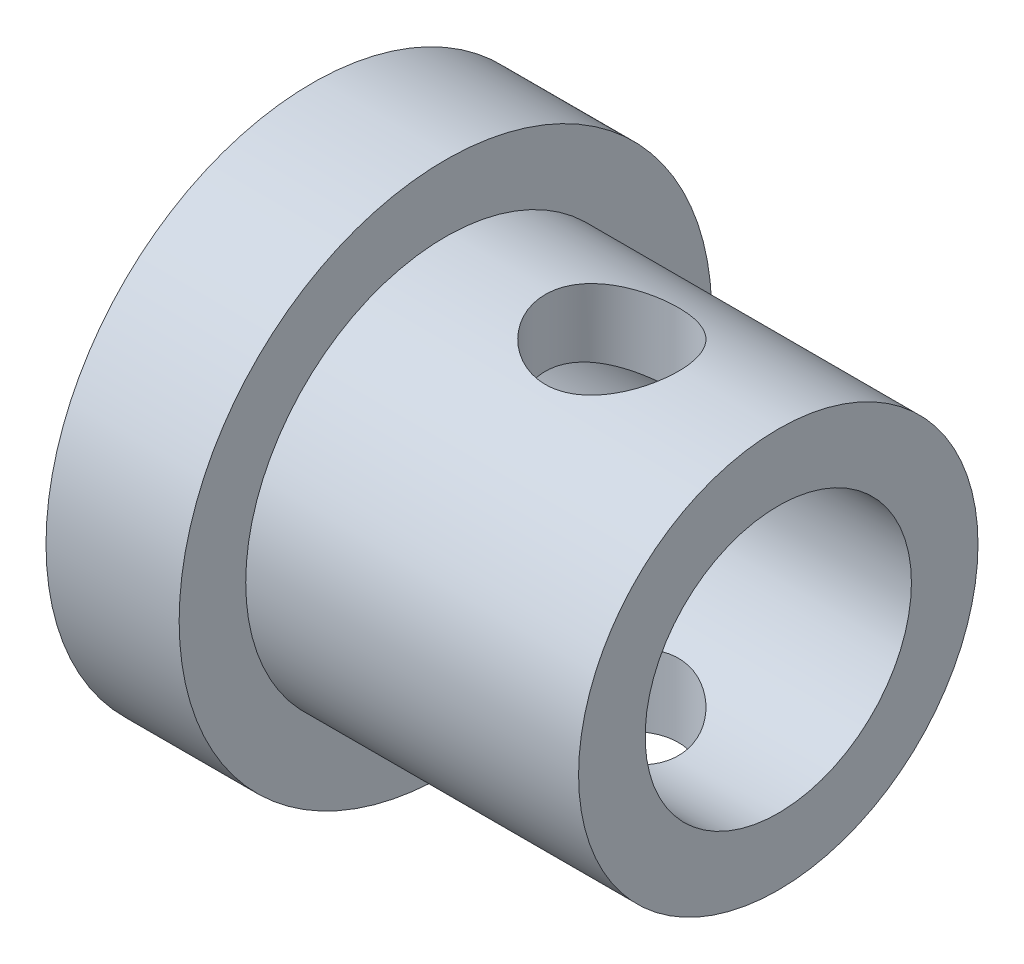
ISO-10303-21;
HEADER;
FILE_DESCRIPTION(('STEP AP214'),'2;1');
FILE_NAME('part.step','',(''),(''),'','','');
FILE_SCHEMA(('AUTOMOTIVE_DESIGN { 1 0 10303 214 1 1 1 1 }'));
ENDSEC;
DATA;
#1=APPLICATION_CONTEXT('core data for automotive mechanical design processes');
#2=APPLICATION_PROTOCOL_DEFINITION('international standard','automotive_design',2000,#1);
#3=PRODUCT_CONTEXT('',#1,'mechanical');
#4=PRODUCT('Part','Part','',(#3));
#5=PRODUCT_RELATED_PRODUCT_CATEGORY('part','',(#4));
#6=PRODUCT_DEFINITION_FORMATION('','',#4);
#7=PRODUCT_DEFINITION_CONTEXT('part definition',#1,'design');
#8=PRODUCT_DEFINITION('design','',#6,#7);
#9=PRODUCT_DEFINITION_SHAPE('','',#8);
#10=(LENGTH_UNIT() NAMED_UNIT(*) SI_UNIT(.MILLI.,.METRE.));
#11=(NAMED_UNIT(*) PLANE_ANGLE_UNIT() SI_UNIT($,.RADIAN.));
#12=(NAMED_UNIT(*) SI_UNIT($,.STERADIAN.) SOLID_ANGLE_UNIT());
#13=UNCERTAINTY_MEASURE_WITH_UNIT(LENGTH_MEASURE(1.E-05),#10,'distance_accuracy_value','');
#14=(GEOMETRIC_REPRESENTATION_CONTEXT(3) GLOBAL_UNCERTAINTY_ASSIGNED_CONTEXT((#13)) GLOBAL_UNIT_ASSIGNED_CONTEXT((#10,
#11,#12)) REPRESENTATION_CONTEXT('',''));
#15=CARTESIAN_POINT('',(0.,0.,0.));
#16=DIRECTION('',(0.,0.,1.));
#17=DIRECTION('',(1.,0.,0.));
#18=AXIS2_PLACEMENT_3D('',#15,#16,#17);
#19=CARTESIAN_POINT('',(3.5,0.,0.));
#20=DIRECTION('',(-1.,0.,0.));
#21=DIRECTION('',(0.,0.,1.));
#22=AXIS2_PLACEMENT_3D('',#19,#20,#21);
#23=CYLINDRICAL_SURFACE('',#22,3.);
#24=CARTESIAN_POINT('',(1.,-2.82842712474619,1.));
#25=CARTESIAN_POINT('',(1.05446817481068,-2.82842694532735,1.0000002579478));
#26=CARTESIAN_POINT('',(1.10893479977153,-2.83001769372806,0.99553478369814));
#27=CARTESIAN_POINT('',(1.21625442095062,-2.8361757417458,0.977851131702564));
#28=CARTESIAN_POINT('',(1.26910714986394,-2.8407435316722,0.964631512170673));
#29=CARTESIAN_POINT('',(1.37162689301281,-2.85228203663888,0.929955485680262));
#30=CARTESIAN_POINT('',(1.42129992944688,-2.8592480396464,0.908515221402));
#31=CARTESIAN_POINT('',(1.5163600485438,-2.87479122017008,0.858061628442627));
#32=CARTESIAN_POINT('',(1.5617461825525,-2.88336875305432,0.829046628860522));
#33=CARTESIAN_POINT('',(1.64871996233949,-2.90154489405589,0.763051146442527));
#34=CARTESIAN_POINT('',(1.69011542867204,-2.91116894844139,0.725824341377825));
#35=CARTESIAN_POINT('',(1.76620680122432,-2.93013864801508,0.644987667214489));
#36=CARTESIAN_POINT('',(1.80090163158228,-2.93948424829099,0.601376775052401));
#37=CARTESIAN_POINT('',(1.86347889732968,-2.95713866921658,0.507604507964983));
#38=CARTESIAN_POINT('',(1.89115997061798,-2.96541407701568,0.457301911224518));
#39=CARTESIAN_POINT('',(1.93759158512749,-2.97969586771021,0.352431222987481));
#40=CARTESIAN_POINT('',(1.9563445331769,-2.98570286203012,0.297864285687214));
#41=CARTESIAN_POINT('',(1.9837358546324,-2.99459075431897,0.188028817433492));
#42=CARTESIAN_POINT('',(1.99270344625701,-2.99757314777558,0.132850754852967));
#43=CARTESIAN_POINT('',(2.00131629336066,-3.00043608218249,0.0216978748240906));
#44=CARTESIAN_POINT('',(2.00096395165242,-3.00031742262891,-0.0342767335438934));
#45=CARTESIAN_POINT('',(1.99115574543397,-2.99706039618736,-0.143103515193818));
#46=CARTESIAN_POINT('',(1.98205747152549,-2.99404064755135,-0.195992048591668));
#47=CARTESIAN_POINT('',(1.95560701901955,-2.98546967339714,-0.299443438822161));
#48=CARTESIAN_POINT('',(1.93825428102024,-2.97991827631115,-0.350006137779176));
#49=CARTESIAN_POINT('',(1.89557868269387,-2.96675670293292,-0.448152474842014));
#50=CARTESIAN_POINT('',(1.87015406145322,-2.9591204252427,-0.495688220968999));
#51=CARTESIAN_POINT('',(1.81214029455161,-2.94258393038665,-0.58592432552717));
#52=CARTESIAN_POINT('',(1.77954915667336,-2.93368336200518,-0.62862333438477));
#53=CARTESIAN_POINT('',(1.70632560653926,-2.9150619185089,-0.710100866551907));
#54=CARTESIAN_POINT('',(1.66538684215456,-2.90532215172667,-0.748600157067556));
#55=CARTESIAN_POINT('',(1.57755127427734,-2.88647335245111,-0.81827725959589));
#56=CARTESIAN_POINT('',(1.53065355428676,-2.8773644173145,-0.849453943273005));
#57=CARTESIAN_POINT('',(1.43134637438458,-2.86070525135531,-0.903987455042732));
#58=CARTESIAN_POINT('',(1.37886786863219,-2.85317909338821,-0.927226463651049));
#59=CARTESIAN_POINT('',(1.27042860573374,-2.84081650878299,-0.964443193299507));
#60=CARTESIAN_POINT('',(1.21446931877818,-2.83597895501223,-0.978424795755529));
#61=CARTESIAN_POINT('',(1.10336164459938,-2.8297963630207,-0.996161282090474));
#62=CARTESIAN_POINT('',(1.04829057525428,-2.82830360315139,-1.00034909550575));
#63=CARTESIAN_POINT('',(0.938223850882962,-2.828566720628,-0.999605438911605));
#64=CARTESIAN_POINT('',(0.883228183975239,-2.83032200792768,-0.99467562522726));
#65=CARTESIAN_POINT('',(0.776843034288837,-2.83673618089379,-0.97622565155183));
#66=CARTESIAN_POINT('',(0.725394569849359,-2.84129325440593,-0.963006393980555));
#67=CARTESIAN_POINT('',(0.625456393760615,-2.8526855367127,-0.928713862560596));
#68=CARTESIAN_POINT('',(0.576967208409165,-2.85952114934907,-0.907639196363457));
#69=CARTESIAN_POINT('',(0.482619579153058,-2.87496877595718,-0.8574743407389));
#70=CARTESIAN_POINT('',(0.436893357358213,-2.8836302566561,-0.828151118358487));
#71=CARTESIAN_POINT('',(0.350853947616265,-2.90165768730984,-0.762585630557568));
#72=CARTESIAN_POINT('',(0.310542361338776,-2.911023844438,-0.726341325498784));
#73=CARTESIAN_POINT('',(0.234472015909365,-2.92995038637844,-0.645891705900322));
#74=CARTESIAN_POINT('',(0.199025609981151,-2.93949843577895,-0.601387270546651));
#75=CARTESIAN_POINT('',(0.136083857651955,-2.9572685161311,-0.506827291400257));
#76=CARTESIAN_POINT('',(0.108588228837575,-2.96549059417695,-0.456771944864552));
#77=CARTESIAN_POINT('',(0.062579895138285,-2.97964405810603,-0.352779862432295));
#78=CARTESIAN_POINT('',(0.0440087228519343,-2.98559030004531,-0.298871123321196));
#79=CARTESIAN_POINT('',(0.0162722579398949,-2.99458610837774,-0.188458465846016));
#80=CARTESIAN_POINT('',(0.00710357011949681,-2.99763672034018,-0.131955491953889));
#81=CARTESIAN_POINT('',(-0.00126207760564187,-3.00041863236257,-0.0208153358600406));
#82=CARTESIAN_POINT('',(-0.000907453932375802,-3.00029920089441,0.0337847239200191));
#83=CARTESIAN_POINT('',(0.00865730814640729,-2.99712196519396,0.142111145000174));
#84=CARTESIAN_POINT('',(0.0178667281527638,-2.99406439933567,0.195837576819055));
#85=CARTESIAN_POINT('',(0.0445822345759675,-2.98540914954421,0.300042119432061));
#86=CARTESIAN_POINT('',(0.0619542153529519,-2.9798525836118,0.350558270912795));
#87=CARTESIAN_POINT('',(0.104377531097136,-2.96677160704464,0.44797835093979));
#88=CARTESIAN_POINT('',(0.129430255196942,-2.95924684047901,0.49488162414241));
#89=CARTESIAN_POINT('',(0.187569512102081,-2.94265868828001,0.585634016308809));
#90=CARTESIAN_POINT('',(0.22091868538192,-2.93354872492381,0.629306251557697));
#91=CARTESIAN_POINT('',(0.294257391155915,-2.91492988791425,0.710581026272338));
#92=CARTESIAN_POINT('',(0.334249042261682,-2.90542088771397,0.748181621624259));
#93=CARTESIAN_POINT('',(0.421609355588035,-2.88663279827365,0.817741808833464));
#94=CARTESIAN_POINT('',(0.469205510980768,-2.87737727995345,0.849422965999216));
#95=CARTESIAN_POINT('',(0.569334426898652,-2.86060193316303,0.904314343299799));
#96=CARTESIAN_POINT('',(0.621865893014244,-2.8530816513617,0.927526776814559));
#97=CARTESIAN_POINT('',(0.727961824023833,-2.84101334230535,0.963843828206626));
#98=CARTESIAN_POINT('',(0.781372263565722,-2.83634632944799,0.977357909163268));
#99=CARTESIAN_POINT('',(0.889856050515475,-2.83005383613939,0.995434320161694));
#100=CARTESIAN_POINT('',(0.944928817435749,-2.82842730615135,0.999999739196502));
#101=CARTESIAN_POINT('',(1.,-2.82842712474619,1.));
#102=B_SPLINE_CURVE_WITH_KNOTS('',3,(#24,#25,#26,#27,#28,#29,#30,#31,#32,#33,#34,#35,#36,#37,
#38,#39,#40,#41,#42,#43,#44,#45,#46,#47,#48,#49,#50,#51,#52,#53,#54,#55,#56,#57,#58,#59,#60,#61,
#62,#63,#64,#65,#66,#67,#68,#69,#70,#71,#72,#73,#74,#75,#76,#77,#78,#79,#80,#81,#82,#83,#84,#85,
#86,#87,#88,#89,#90,#91,#92,#93,#94,#95,#96,#97,#98,#99,#100,#101),.UNSPECIFIED.,.T.,.F.,(4,2,2,
2,2,2,2,2,2,2,2,2,2,2,2,2,2,2,2,2,2,2,2,2,2,2,2,2,2,2,2,2,2,2,2,2,2,2,4),(0.,0.163200584775417,
0.32642805496888,0.489336627454544,0.652281166139159,0.821013374229398,0.989772651673597,
1.16293506139029,1.33605076382161,1.50314318760306,1.67019253297699,1.83069004820941,
1.99119844184608,2.15381654855707,2.31647991869394,2.48680174359289,2.65714979607478,
2.82992639837376,3.00263051349689,3.16754291357512,3.33242535830307,3.49164395761849,
3.65089079140019,3.81518857728788,3.979534856552,4.15178808164166,4.32403518750605,
4.49513791183924,4.66617882997229,4.82918084670708,4.99216964002854,5.15256956033503,
5.31299850756315,5.47935519513706,5.64576504425704,5.81868902729217,5.99156778259939,
6.15663212153686,6.32163947179229),.UNSPECIFIED.);
#103=CARTESIAN_POINT('',(1.,-2.82842712474619,1.));
#104=VERTEX_POINT('',#103);
#105=EDGE_CURVE('E72',#104,#104,#102,.T.);
#106=ORIENTED_EDGE('',*,*,#105,.T.);
#107=EDGE_LOOP('',(#106));
#108=FACE_BOUND('',#107,.T.);
#109=CARTESIAN_POINT('',(1.,2.82842712474619,1.));
#110=CARTESIAN_POINT('',(0.945531825189323,2.82842694532735,1.0000002579478));
#111=CARTESIAN_POINT('',(0.891065200228475,2.83001769372806,0.99553478369814));
#112=CARTESIAN_POINT('',(0.783745579049384,2.8361757417458,0.977851131702564));
#113=CARTESIAN_POINT('',(0.730892850136063,2.8407435316722,0.964631512170674));
#114=CARTESIAN_POINT('',(0.628373106987187,2.85228203663888,0.929955485680263));
#115=CARTESIAN_POINT('',(0.578700070553118,2.8592480396464,0.908515221402));
#116=CARTESIAN_POINT('',(0.483639951456205,2.87479122017008,0.858061628442627));
#117=CARTESIAN_POINT('',(0.438253817447503,2.88336875305432,0.829046628860523));
#118=CARTESIAN_POINT('',(0.351280037660512,2.90154489405589,0.763051146442527));
#119=CARTESIAN_POINT('',(0.309884571327957,2.91116894844139,0.725824341377825));
#120=CARTESIAN_POINT('',(0.233793198775676,2.93013864801508,0.644987667214489));
#121=CARTESIAN_POINT('',(0.199098368417716,2.93948424829099,0.601376775052402));
#122=CARTESIAN_POINT('',(0.136521102670319,2.95713866921658,0.507604507964984));
#123=CARTESIAN_POINT('',(0.108840029382019,2.96541407701568,0.457301911224518));
#124=CARTESIAN_POINT('',(0.0624084148725132,2.9796958677102,0.352431222987481));
#125=CARTESIAN_POINT('',(0.0436554668231001,2.98570286203012,0.297864285687214));
#126=CARTESIAN_POINT('',(0.0162641453676014,2.99459075431897,0.188028817433493));
#127=CARTESIAN_POINT('',(0.00729655374299271,2.99757314777558,0.132850754852967));
#128=CARTESIAN_POINT('',(-0.0013162933606595,3.00043608218249,0.0216978748240912));
#129=CARTESIAN_POINT('',(-0.000963951652417497,3.00031742262891,-0.0342767335438928));
#130=CARTESIAN_POINT('',(0.00884425456603261,2.99706039618736,-0.143103515193817));
#131=CARTESIAN_POINT('',(0.0179425284745069,2.99404064755135,-0.195992048591667));
#132=CARTESIAN_POINT('',(0.0443929809804537,2.98546967339714,-0.299443438822161));
#133=CARTESIAN_POINT('',(0.0617457189797547,2.97991827631115,-0.350006137779175));
#134=CARTESIAN_POINT('',(0.104421317306129,2.96675670293292,-0.448152474842013));
#135=CARTESIAN_POINT('',(0.129845938546777,2.9591204252427,-0.495688220968998));
#136=CARTESIAN_POINT('',(0.18785970544839,2.94258393038665,-0.585924325527169));
#137=CARTESIAN_POINT('',(0.220450843326638,2.93368336200518,-0.628623334384769));
#138=CARTESIAN_POINT('',(0.293674393460737,2.9150619185089,-0.710100866551907));
#139=CARTESIAN_POINT('',(0.334613157845441,2.90532215172667,-0.748600157067556));
#140=CARTESIAN_POINT('',(0.422448725722657,2.88647335245111,-0.81827725959589));
#141=CARTESIAN_POINT('',(0.469346445713238,2.8773644173145,-0.849453943273005));
#142=CARTESIAN_POINT('',(0.568653625615415,2.86070525135531,-0.903987455042732));
#143=CARTESIAN_POINT('',(0.621132131367812,2.85317909338821,-0.927226463651049));
#144=CARTESIAN_POINT('',(0.729571394266262,2.84081650878299,-0.964443193299507));
#145=CARTESIAN_POINT('',(0.785530681221824,2.83597895501223,-0.978424795755529));
#146=CARTESIAN_POINT('',(0.896638355400619,2.8297963630207,-0.996161282090474));
#147=CARTESIAN_POINT('',(0.951709424745724,2.82830360315139,-1.00034909550575));
#148=CARTESIAN_POINT('',(1.06177614911704,2.828566720628,-0.999605438911605));
#149=CARTESIAN_POINT('',(1.11677181602476,2.83032200792768,-0.99467562522726));
#150=CARTESIAN_POINT('',(1.22315696571116,2.83673618089379,-0.97622565155183));
#151=CARTESIAN_POINT('',(1.27460543015064,2.84129325440593,-0.963006393980555));
#152=CARTESIAN_POINT('',(1.37454360623938,2.8526855367127,-0.928713862560596));
#153=CARTESIAN_POINT('',(1.42303279159083,2.85952114934907,-0.907639196363457));
#154=CARTESIAN_POINT('',(1.51738042084694,2.87496877595718,-0.857474340738901));
#155=CARTESIAN_POINT('',(1.56310664264179,2.8836302566561,-0.828151118358487));
#156=CARTESIAN_POINT('',(1.64914605238373,2.90165768730984,-0.762585630557568));
#157=CARTESIAN_POINT('',(1.68945763866122,2.91102384443799,-0.726341325498785));
#158=CARTESIAN_POINT('',(1.76552798409063,2.92995038637844,-0.645891705900323));
#159=CARTESIAN_POINT('',(1.80097439001885,2.93949843577895,-0.601387270546652));
#160=CARTESIAN_POINT('',(1.86391614234804,2.9572685161311,-0.506827291400258));
#161=CARTESIAN_POINT('',(1.89141177116242,2.96549059417695,-0.456771944864553));
#162=CARTESIAN_POINT('',(1.93742010486171,2.97964405810603,-0.352779862432296));
#163=CARTESIAN_POINT('',(1.95599127714807,2.98559030004531,-0.298871123321197));
#164=CARTESIAN_POINT('',(1.9837277420601,2.99458610837774,-0.188458465846017));
#165=CARTESIAN_POINT('',(1.9928964298805,2.99763672034018,-0.13195549195389));
#166=CARTESIAN_POINT('',(2.00126207760564,3.00041863236257,-0.0208153358600409));
#167=CARTESIAN_POINT('',(2.00090745393238,3.00029920089441,0.0337847239200188));
#168=CARTESIAN_POINT('',(1.99134269185359,2.99712196519396,0.142111145000173));
#169=CARTESIAN_POINT('',(1.98213327184724,2.99406439933567,0.195837576819055));
#170=CARTESIAN_POINT('',(1.95541776542403,2.98540914954421,0.30004211943206));
#171=CARTESIAN_POINT('',(1.93804578464705,2.9798525836118,0.350558270912795));
#172=CARTESIAN_POINT('',(1.89562246890286,2.96677160704464,0.447978350939789));
#173=CARTESIAN_POINT('',(1.87056974480306,2.95924684047901,0.494881624142409));
#174=CARTESIAN_POINT('',(1.81243048789792,2.94265868828001,0.585634016308809));
#175=CARTESIAN_POINT('',(1.77908131461808,2.93354872492381,0.629306251557696));
#176=CARTESIAN_POINT('',(1.70574260884409,2.91492988791425,0.710581026272338));
#177=CARTESIAN_POINT('',(1.66575095773832,2.90542088771397,0.748181621624259));
#178=CARTESIAN_POINT('',(1.57839064441197,2.88663279827365,0.817741808833464));
#179=CARTESIAN_POINT('',(1.53079448901923,2.87737727995345,0.849422965999216));
#180=CARTESIAN_POINT('',(1.43066557310135,2.86060193316303,0.904314343299799));
#181=CARTESIAN_POINT('',(1.37813410698576,2.8530816513617,0.927526776814559));
#182=CARTESIAN_POINT('',(1.27203817597617,2.84101334230535,0.963843828206626));
#183=CARTESIAN_POINT('',(1.21862773643428,2.83634632944799,0.977357909163268));
#184=CARTESIAN_POINT('',(1.11014394948452,2.83005383613939,0.995434320161694));
#185=CARTESIAN_POINT('',(1.05507118256425,2.82842730615135,0.999999739196502));
#186=CARTESIAN_POINT('',(1.,2.82842712474619,1.));
#187=B_SPLINE_CURVE_WITH_KNOTS('',3,(#109,#110,#111,#112,#113,#114,#115,#116,#117,#118,#119,
#120,#121,#122,#123,#124,#125,#126,#127,#128,#129,#130,#131,#132,#133,#134,#135,#136,#137,#138,
#139,#140,#141,#142,#143,#144,#145,#146,#147,#148,#149,#150,#151,#152,#153,#154,#155,#156,#157,
#158,#159,#160,#161,#162,#163,#164,#165,#166,#167,#168,#169,#170,#171,#172,#173,#174,#175,#176,
#177,#178,#179,#180,#181,#182,#183,#184,#185,#186),.UNSPECIFIED.,.T.,.F.,(4,2,2,2,2,2,2,2,2,2,2,
2,2,2,2,2,2,2,2,2,2,2,2,2,2,2,2,2,2,2,2,2,2,2,2,2,2,2,4),(0.,0.163200584775417,0.32642805496888,
0.489336627454544,0.652281166139158,0.821013374229398,0.989772651673596,1.16293506139029,
1.33605076382161,1.50314318760306,1.67019253297699,1.83069004820941,1.99119844184608,
2.15381654855707,2.31647991869394,2.48680174359289,2.65714979607478,2.82992639837376,
3.00263051349688,3.16754291357512,3.33242535830307,3.49164395761849,3.65089079140019,
3.81518857728788,3.979534856552,4.15178808164165,4.32403518750605,4.49513791183924,
4.66617882997229,4.82918084670708,4.99216964002854,5.15256956033503,5.31299850756315,
5.47935519513707,5.64576504425704,5.81868902729217,5.9915677825994,6.15663212153686,
6.32163947179229),.UNSPECIFIED.);
#188=CARTESIAN_POINT('',(1.,2.82842712474619,1.));
#189=VERTEX_POINT('',#188);
#190=EDGE_CURVE('E68',#189,#189,#187,.T.);
#191=ORIENTED_EDGE('',*,*,#190,.T.);
#192=EDGE_LOOP('',(#191));
#193=FACE_BOUND('',#192,.T.);
#194=CARTESIAN_POINT('',(3.5,0.,0.));
#195=DIRECTION('',(1.,0.,0.));
#196=DIRECTION('',(0.,0.,-1.));
#197=AXIS2_PLACEMENT_3D('',#194,#195,#196);
#198=CIRCLE('',#197,3.);
#199=CARTESIAN_POINT('',(3.5,0.,-3.));
#200=VERTEX_POINT('',#199);
#201=EDGE_CURVE('E43',#200,#200,#198,.T.);
#202=ORIENTED_EDGE('',*,*,#201,.F.);
#203=EDGE_LOOP('',(#202));
#204=FACE_BOUND('',#203,.T.);
#205=CARTESIAN_POINT('',(-1.5,0.,0.));
#206=DIRECTION('',(-1.,0.,0.));
#207=DIRECTION('',(0.,0.,1.));
#208=AXIS2_PLACEMENT_3D('',#205,#206,#207);
#209=CIRCLE('',#208,3.);
#210=CARTESIAN_POINT('',(-1.5,0.,3.));
#211=VERTEX_POINT('',#210);
#212=EDGE_CURVE('E10',#211,#211,#209,.T.);
#213=ORIENTED_EDGE('',*,*,#212,.F.);
#214=EDGE_LOOP('',(#213));
#215=FACE_BOUND('',#214,.T.);
#216=ADVANCED_FACE('F31',(#108,#193,#204,#215),#23,.T.);
#217=CARTESIAN_POINT('',(3.5,0.,0.));
#218=DIRECTION('',(1.,0.,0.));
#219=DIRECTION('',(0.,0.,-1.));
#220=AXIS2_PLACEMENT_3D('',#217,#218,#219);
#221=PLANE('',#220);
#222=CARTESIAN_POINT('',(3.5,0.,0.));
#223=DIRECTION('',(1.,0.,0.));
#224=DIRECTION('',(0.,0.,-1.));
#225=AXIS2_PLACEMENT_3D('',#222,#223,#224);
#226=CIRCLE('',#225,2.);
#227=CARTESIAN_POINT('',(3.5,0.,-2.));
#228=VERTEX_POINT('',#227);
#229=EDGE_CURVE('E77',#228,#228,#226,.T.);
#230=ORIENTED_EDGE('',*,*,#229,.F.);
#231=EDGE_LOOP('',(#230));
#232=FACE_BOUND('',#231,.T.);
#233=ORIENTED_EDGE('',*,*,#201,.T.);
#234=EDGE_LOOP('',(#233));
#235=FACE_BOUND('',#234,.T.);
#236=ADVANCED_FACE('F93',(#232,#235),#221,.T.);
#237=CARTESIAN_POINT('',(-1.5,0.,0.));
#238=DIRECTION('',(-1.,0.,0.));
#239=DIRECTION('',(0.,0.,1.));
#240=AXIS2_PLACEMENT_3D('',#237,#238,#239);
#241=CYLINDRICAL_SURFACE('',#240,4.);
#242=CARTESIAN_POINT('',(-1.5,0.,0.));
#243=DIRECTION('',(-1.,0.,0.));
#244=DIRECTION('',(0.,0.,1.));
#245=AXIS2_PLACEMENT_3D('',#242,#243,#244);
#246=CIRCLE('',#245,4.);
#247=CARTESIAN_POINT('',(-1.5,0.,4.));
#248=VERTEX_POINT('',#247);
#249=EDGE_CURVE('E48',#248,#248,#246,.T.);
#250=ORIENTED_EDGE('',*,*,#249,.T.);
#251=EDGE_LOOP('',(#250));
#252=FACE_BOUND('',#251,.T.);
#253=CARTESIAN_POINT('',(-3.5,0.,0.));
#254=DIRECTION('',(-1.,0.,0.));
#255=DIRECTION('',(0.,0.,1.));
#256=AXIS2_PLACEMENT_3D('',#253,#254,#255);
#257=CIRCLE('',#256,4.);
#258=CARTESIAN_POINT('',(-3.5,0.,4.));
#259=VERTEX_POINT('',#258);
#260=EDGE_CURVE('E81',#259,#259,#257,.T.);
#261=ORIENTED_EDGE('',*,*,#260,.F.);
#262=EDGE_LOOP('',(#261));
#263=FACE_BOUND('',#262,.T.);
#264=ADVANCED_FACE('F90',(#252,#263),#241,.T.);
#265=CARTESIAN_POINT('',(-1.5,0.,0.));
#266=DIRECTION('',(-1.,0.,0.));
#267=DIRECTION('',(0.,0.,1.));
#268=AXIS2_PLACEMENT_3D('',#265,#266,#267);
#269=PLANE('',#268);
#270=ORIENTED_EDGE('',*,*,#212,.T.);
#271=EDGE_LOOP('',(#270));
#272=FACE_BOUND('',#271,.T.);
#273=ORIENTED_EDGE('',*,*,#249,.F.);
#274=EDGE_LOOP('',(#273));
#275=FACE_BOUND('',#274,.T.);
#276=ADVANCED_FACE('F92',(#272,#275),#269,.F.);
#277=CARTESIAN_POINT('',(-3.5,0.,0.));
#278=DIRECTION('',(1.,0.,0.));
#279=DIRECTION('',(0.,0.,-1.));
#280=AXIS2_PLACEMENT_3D('',#277,#278,#279);
#281=PLANE('',#280);
#282=CARTESIAN_POINT('',(-3.5,0.,0.));
#283=DIRECTION('',(1.,0.,0.));
#284=DIRECTION('',(0.,0.,-1.));
#285=AXIS2_PLACEMENT_3D('',#282,#283,#284);
#286=CIRCLE('',#285,2.);
#287=CARTESIAN_POINT('',(-3.5,0.,-2.));
#288=VERTEX_POINT('',#287);
#289=EDGE_CURVE('E78',#288,#288,#286,.T.);
#290=ORIENTED_EDGE('',*,*,#289,.T.);
#291=EDGE_LOOP('',(#290));
#292=FACE_BOUND('',#291,.T.);
#293=ORIENTED_EDGE('',*,*,#260,.T.);
#294=EDGE_LOOP('',(#293));
#295=FACE_BOUND('',#294,.T.);
#296=ADVANCED_FACE('F88',(#292,#295),#281,.F.);
#297=CARTESIAN_POINT('',(-3.5,0.,0.));
#298=DIRECTION('',(1.,0.,0.));
#299=DIRECTION('',(0.,0.,-1.));
#300=AXIS2_PLACEMENT_3D('',#297,#298,#299);
#301=CYLINDRICAL_SURFACE('',#300,2.);
#302=CARTESIAN_POINT('',(1.,-1.73205080756888,1.));
#303=CARTESIAN_POINT('',(0.94789219180475,-1.73205534728459,0.999996363074532));
#304=CARTESIAN_POINT('',(0.895718588474954,-1.73443801187756,0.995899970733217));
#305=CARTESIAN_POINT('',(0.792972735322847,-1.74362366452052,0.979723209898053));
#306=CARTESIAN_POINT('',(0.742404084956592,-1.75043594055559,0.967626064554179));
#307=CARTESIAN_POINT('',(0.644548335656059,-1.76749346605398,0.936099948699812));
#308=CARTESIAN_POINT('',(0.597245347526413,-1.77772043473252,0.916709952493731));
#309=CARTESIAN_POINT('',(0.50657579800328,-1.80042664816858,0.871267525376372));
#310=CARTESIAN_POINT('',(0.463209449737542,-1.81290601476065,0.845214734035773));
#311=CARTESIAN_POINT('',(0.377694271442494,-1.83996869057441,0.784666540530879));
#312=CARTESIAN_POINT('',(0.335940864326456,-1.85464063637954,0.74965203614377));
#313=CARTESIAN_POINT('',(0.25859161159329,-1.88371982785706,0.673253807614468));
#314=CARTESIAN_POINT('',(0.222998837416479,-1.8981269383125,0.631866925782293));
#315=CARTESIAN_POINT('',(0.156632848852337,-1.92621476952949,0.540489563414546));
#316=CARTESIAN_POINT('',(0.12634623214047,-1.93978106418172,0.490107189012575));
#317=CARTESIAN_POINT('',(0.0748591467542373,-1.96350756099529,0.384157026599504));
#318=CARTESIAN_POINT('',(0.0536529438628296,-1.97366991183742,0.328592538138155));
#319=CARTESIAN_POINT('',(0.0224953386989024,-1.98880461244237,0.218044943925977));
#320=CARTESIAN_POINT('',(0.0118504736444666,-1.99409480220892,0.163301790488817));
#321=CARTESIAN_POINT('',(-0.000166118675038273,-2.00007583846067,0.0525706286978478));
#322=CARTESIAN_POINT('',(-0.00154345679571052,-2.0007694678459,-0.0034166058437388));
#323=CARTESIAN_POINT('',(0.0047466739703493,-1.9976298191645,-0.10983252442375));
#324=CARTESIAN_POINT('',(0.0116380155212225,-1.9941849589216,-0.160321199176792));
#325=CARTESIAN_POINT('',(0.0328808439046571,-1.98374245259747,-0.259313771918322));
#326=CARTESIAN_POINT('',(0.0472328889762229,-1.97674454066394,-0.307817521093926));
#327=CARTESIAN_POINT('',(0.0830825660898132,-1.95971583287654,-0.402309391569554));
#328=CARTESIAN_POINT('',(0.104676313172067,-1.94964441529199,-0.448253423515179));
#329=CARTESIAN_POINT('',(0.154263416201493,-1.92737645986687,-0.535976801513329));
#330=CARTESIAN_POINT('',(0.18225906330235,-1.91517916157484,-0.577754648838646));
#331=CARTESIAN_POINT('',(0.246895351533015,-1.88844394399229,-0.660173660898195));
#332=CARTESIAN_POINT('',(0.28410302832601,-1.87379375998175,-0.700334075029361));
#333=CARTESIAN_POINT('',(0.364589724930177,-1.84454340586812,-0.77410437029778));
#334=CARTESIAN_POINT('',(0.407873372274063,-1.82994328265629,-0.807709211574231));
#335=CARTESIAN_POINT('',(0.502648192424087,-1.80144156092485,-0.869505334642212));
#336=CARTESIAN_POINT('',(0.554486023054211,-1.78764319990708,-0.897217314978052));
#337=CARTESIAN_POINT('',(0.662937671358998,-1.76375450278576,-0.943319113001232));
#338=CARTESIAN_POINT('',(0.719546433017562,-1.75366030046067,-0.96171865821089));
#339=CARTESIAN_POINT('',(0.831214511282791,-1.73944635817034,-0.987180211025041));
#340=CARTESIAN_POINT('',(0.886041119043552,-1.73491655848496,-0.995025122119976));
#341=CARTESIAN_POINT('',(0.996401341516542,-1.7311791936161,-1.00151694661143));
#342=CARTESIAN_POINT('',(1.05193442911979,-1.73196786889312,-1.00017035731503));
#343=CARTESIAN_POINT('',(1.15565391857873,-1.73834336540585,-0.989036043343966));
#344=CARTESIAN_POINT('',(1.20397945110793,-1.74339587506654,-0.980187816712467));
#345=CARTESIAN_POINT('',(1.29836778627096,-1.75694021551341,-0.955696284632441));
#346=CARTESIAN_POINT('',(1.34442985074661,-1.76543316005034,-0.940050778623614));
#347=CARTESIAN_POINT('',(1.4354113309027,-1.78536222079657,-0.901647588604886));
#348=CARTESIAN_POINT('',(1.48017901685355,-1.79691643243063,-0.878594063692723));
#349=CARTESIAN_POINT('',(1.56546927153899,-1.8215611949725,-0.826287064015804));
#350=CARTESIAN_POINT('',(1.60598964351328,-1.83465253355148,-0.797030404332216));
#351=CARTESIAN_POINT('',(1.68697876752355,-1.86287998456336,-0.728837167198853));
#352=CARTESIAN_POINT('',(1.72679715071766,-1.87806583154289,-0.689145272314967));
#353=CARTESIAN_POINT('',(1.79941223799359,-1.90734234977893,-0.603404495398289));
#354=CARTESIAN_POINT('',(1.83220657023054,-1.92143265007709,-0.557353474655347));
#355=CARTESIAN_POINT('',(1.8905737259501,-1.94741361690957,-0.458535362558757));
#356=CARTESIAN_POINT('',(1.91593311821091,-1.95923641672029,-0.405623097574113));
#357=CARTESIAN_POINT('',(1.95713790385739,-1.97883354959301,-0.295522364641082));
#358=CARTESIAN_POINT('',(1.97299165136631,-1.98661143676373,-0.238337701392176));
#359=CARTESIAN_POINT('',(1.99336856417466,-1.99667508181883,-0.126979682330417));
#360=CARTESIAN_POINT('',(1.99879787587611,-1.99939927908191,-0.0730114438504569));
#361=CARTESIAN_POINT('',(2.0008432654544,-2.00042130375131,0.0351259859512038));
#362=CARTESIAN_POINT('',(1.99746242852356,-1.9987206806689,0.089295100295087));
#363=CARTESIAN_POINT('',(1.98258359320438,-1.99133968837923,0.192537992317147));
#364=CARTESIAN_POINT('',(1.97163515074233,-1.9859289466799,0.241712317811264));
#365=CARTESIAN_POINT('',(1.94267300069703,-1.97192093663423,0.337445952183618));
#366=CARTESIAN_POINT('',(1.92465827990655,-1.96332321132796,0.384004884955509));
#367=CARTESIAN_POINT('',(1.88127294783403,-1.9432593074812,0.475423406244885));
#368=CARTESIAN_POINT('',(1.85562067679216,-1.93168617198799,0.520125142700047));
#369=CARTESIAN_POINT('',(1.79804206914095,-1.90688133141826,0.604774641814025));
#370=CARTESIAN_POINT('',(1.76611285088433,-1.89364886558361,0.644720207414908));
#371=CARTESIAN_POINT('',(1.6932028609773,-1.86528610226628,0.722914004156892));
#372=CARTESIAN_POINT('',(1.65163751252281,-1.85009799011698,0.760597684539272));
#373=CARTESIAN_POINT('',(1.56254927887023,-1.82063076162852,0.828663287394675));
#374=CARTESIAN_POINT('',(1.51502117913232,-1.80635245761865,0.859038750010059));
#375=CARTESIAN_POINT('',(1.41336335341904,-1.77999605304916,0.912431079785655));
#376=CARTESIAN_POINT('',(1.35907246887126,-1.7680017425627,0.93518506596094));
#377=CARTESIAN_POINT('',(1.24666759566022,-1.74866156328351,0.970878709506412));
#378=CARTESIAN_POINT('',(1.18856711108731,-1.74130016147702,0.983851191175347));
#379=CARTESIAN_POINT('',(1.108194644348,-1.7352927260179,0.994367007864415));
#380=CARTESIAN_POINT('',(1.08663210560212,-1.73408129005152,0.996476104963851));
#381=CARTESIAN_POINT('',(1.04338351931776,-1.7324593588775,0.999293405089963));
#382=CARTESIAN_POINT('',(1.02169746361413,-1.73204891725109,1.00000151439987));
#383=CARTESIAN_POINT('',(1.,-1.73205080756888,1.));
#384=B_SPLINE_CURVE_WITH_KNOTS('',3,(#302,#303,#304,#305,#306,#307,#308,#309,#310,#311,#312,
#313,#314,#315,#316,#317,#318,#319,#320,#321,#322,#323,#324,#325,#326,#327,#328,#329,#330,#331,
#332,#333,#334,#335,#336,#337,#338,#339,#340,#341,#342,#343,#344,#345,#346,#347,#348,#349,#350,
#351,#352,#353,#354,#355,#356,#357,#358,#359,#360,#361,#362,#363,#364,#365,#366,#367,#368,#369,
#370,#371,#372,#373,#374,#375,#376,#377,#378,#379,#380,#381,#382,#383),.UNSPECIFIED.,.T.,.F.,(4,
2,2,2,2,2,2,2,2,2,2,2,2,2,2,2,2,2,2,2,2,2,2,2,2,2,2,2,2,2,2,2,2,2,2,2,2,2,2,2,4),(0.,
0.156232122594716,0.312792892824805,0.468528595918886,0.62427272544515,0.792862312498234,
0.96153571084371,1.14157892238764,1.32150826963891,1.48863484967935,1.6556602368604,
1.80816097484538,1.96067312517455,2.11529534731147,2.26997299350272,2.43927191456891,
2.60870048245919,2.78888841729448,2.96888774211705,3.13462290854212,3.30024093188373,
3.44774183424026,3.59529052436063,3.74967296406088,3.90413486220047,4.07806743580613,
4.25205864978202,4.43064181412966,4.60906779808772,4.77112270389487,4.93312086793972,
5.08444424871492,5.23578933512013,5.39360750719472,5.55149830100719,5.72510241850068,
5.89885942845154,6.07810749038605,6.2567513300276,6.32180135185309,6.38685572494541),.UNSPECIFIED.);
#385=CARTESIAN_POINT('',(1.,-1.73205080756888,1.));
#386=VERTEX_POINT('',#385);
#387=EDGE_CURVE('E35',#386,#386,#384,.T.);
#388=ORIENTED_EDGE('',*,*,#387,.T.);
#389=EDGE_LOOP('',(#388));
#390=FACE_BOUND('',#389,.T.);
#391=CARTESIAN_POINT('',(1.,1.73205080756888,1.));
#392=CARTESIAN_POINT('',(1.05210780819525,1.73205534728459,0.999996363074532));
#393=CARTESIAN_POINT('',(1.10428141152505,1.73443801187756,0.995899970733217));
#394=CARTESIAN_POINT('',(1.20702726467715,1.74362366452052,0.979723209898053));
#395=CARTESIAN_POINT('',(1.25759591504341,1.75043594055559,0.967626064554179));
#396=CARTESIAN_POINT('',(1.35545166434394,1.76749346605398,0.936099948699812));
#397=CARTESIAN_POINT('',(1.40275465247359,1.77772043473252,0.916709952493731));
#398=CARTESIAN_POINT('',(1.49342420199672,1.80042664816858,0.871267525376372));
#399=CARTESIAN_POINT('',(1.53679055026246,1.81290601476065,0.845214734035773));
#400=CARTESIAN_POINT('',(1.62230572855751,1.83996869057441,0.784666540530879));
#401=CARTESIAN_POINT('',(1.66405913567354,1.85464063637954,0.74965203614377));
#402=CARTESIAN_POINT('',(1.74140838840671,1.88371982785706,0.673253807614468));
#403=CARTESIAN_POINT('',(1.77700116258352,1.8981269383125,0.631866925782293));
#404=CARTESIAN_POINT('',(1.84336715114766,1.92621476952949,0.540489563414546));
#405=CARTESIAN_POINT('',(1.87365376785953,1.93978106418172,0.490107189012575));
#406=CARTESIAN_POINT('',(1.92514085324576,1.96350756099529,0.384157026599504));
#407=CARTESIAN_POINT('',(1.94634705613717,1.97366991183742,0.328592538138155));
#408=CARTESIAN_POINT('',(1.9775046613011,1.98880461244237,0.218044943925977));
#409=CARTESIAN_POINT('',(1.98814952635553,1.99409480220892,0.163301790488817));
#410=CARTESIAN_POINT('',(2.00016611867504,2.00007583846067,0.0525706286978479));
#411=CARTESIAN_POINT('',(2.00154345679571,2.0007694678459,-0.00341660584373873));
#412=CARTESIAN_POINT('',(1.99525332602965,1.9976298191645,-0.10983252442375));
#413=CARTESIAN_POINT('',(1.98836198447878,1.9941849589216,-0.160321199176792));
#414=CARTESIAN_POINT('',(1.96711915609534,1.98374245259747,-0.259313771918322));
#415=CARTESIAN_POINT('',(1.95276711102378,1.97674454066394,-0.307817521093926));
#416=CARTESIAN_POINT('',(1.91691743391019,1.95971583287654,-0.402309391569554));
#417=CARTESIAN_POINT('',(1.89532368682793,1.94964441529199,-0.448253423515179));
#418=CARTESIAN_POINT('',(1.84573658379851,1.92737645986687,-0.535976801513329));
#419=CARTESIAN_POINT('',(1.81774093669765,1.91517916157484,-0.577754648838646));
#420=CARTESIAN_POINT('',(1.75310464846698,1.88844394399229,-0.660173660898195));
#421=CARTESIAN_POINT('',(1.71589697167399,1.87379375998175,-0.700334075029361));
#422=CARTESIAN_POINT('',(1.63541027506982,1.84454340586812,-0.774104370297781));
#423=CARTESIAN_POINT('',(1.59212662772594,1.82994328265629,-0.807709211574231));
#424=CARTESIAN_POINT('',(1.49735180757591,1.80144156092485,-0.869505334642212));
#425=CARTESIAN_POINT('',(1.44551397694579,1.78764319990707,-0.897217314978052));
#426=CARTESIAN_POINT('',(1.337062328641,1.76375450278576,-0.943319113001232));
#427=CARTESIAN_POINT('',(1.28045356698244,1.75366030046067,-0.96171865821089));
#428=CARTESIAN_POINT('',(1.16878548871721,1.73944635817034,-0.987180211025041));
#429=CARTESIAN_POINT('',(1.11395888095645,1.73491655848496,-0.995025122119976));
#430=CARTESIAN_POINT('',(1.00359865848346,1.73117919361609,-1.00151694661143));
#431=CARTESIAN_POINT('',(0.948065570880213,1.73196786889312,-1.00017035731503));
#432=CARTESIAN_POINT('',(0.844346081421271,1.73834336540585,-0.989036043343966));
#433=CARTESIAN_POINT('',(0.796020548892072,1.74339587506654,-0.980187816712467));
#434=CARTESIAN_POINT('',(0.701632213729041,1.75694021551341,-0.955696284632441));
#435=CARTESIAN_POINT('',(0.655570149253392,1.76543316005034,-0.940050778623615));
#436=CARTESIAN_POINT('',(0.564588669097304,1.78536222079657,-0.901647588604886));
#437=CARTESIAN_POINT('',(0.519820983146448,1.79691643243063,-0.878594063692723));
#438=CARTESIAN_POINT('',(0.434530728461006,1.8215611949725,-0.826287064015805));
#439=CARTESIAN_POINT('',(0.394010356486717,1.83465253355148,-0.797030404332217));
#440=CARTESIAN_POINT('',(0.313021232476452,1.86287998456336,-0.728837167198854));
#441=CARTESIAN_POINT('',(0.273202849282341,1.87806583154289,-0.689145272314967));
#442=CARTESIAN_POINT('',(0.200587762006409,1.90734234977892,-0.603404495398289));
#443=CARTESIAN_POINT('',(0.16779342976946,1.92143265007709,-0.557353474655347));
#444=CARTESIAN_POINT('',(0.109426274049898,1.94741361690957,-0.458535362558758));
#445=CARTESIAN_POINT('',(0.0840668817890901,1.95923641672029,-0.405623097574113));
#446=CARTESIAN_POINT('',(0.0428620961426073,1.97883354959301,-0.295522364641082));
#447=CARTESIAN_POINT('',(0.027008348633695,1.98661143676373,-0.238337701392176));
#448=CARTESIAN_POINT('',(0.00663143582533808,1.99667508181883,-0.126979682330417));
#449=CARTESIAN_POINT('',(0.00120212412388615,1.99939927908191,-0.0730114438504573));
#450=CARTESIAN_POINT('',(-0.000843265454401555,2.00042130375131,0.0351259859512033));
#451=CARTESIAN_POINT('',(0.00253757147643598,1.9987206806689,0.0892951002950865));
#452=CARTESIAN_POINT('',(0.017416406795624,1.99133968837923,0.192537992317147));
#453=CARTESIAN_POINT('',(0.028364849257671,1.9859289466799,0.241712317811263));
#454=CARTESIAN_POINT('',(0.0573269993029705,1.97192093663423,0.337445952183617));
#455=CARTESIAN_POINT('',(0.0753417200934524,1.96332321132796,0.384004884955508));
#456=CARTESIAN_POINT('',(0.118727052165973,1.9432593074812,0.475423406244885));
#457=CARTESIAN_POINT('',(0.144379323207839,1.93168617198799,0.520125142700046));
#458=CARTESIAN_POINT('',(0.20195793085905,1.90688133141826,0.604774641814025));
#459=CARTESIAN_POINT('',(0.233887149115673,1.89364886558361,0.644720207414907));
#460=CARTESIAN_POINT('',(0.306797139022702,1.86528610226628,0.722914004156891));
#461=CARTESIAN_POINT('',(0.348362487477192,1.85009799011698,0.760597684539272));
#462=CARTESIAN_POINT('',(0.43745072112977,1.82063076162852,0.828663287394675));
#463=CARTESIAN_POINT('',(0.484978820867684,1.80635245761865,0.859038750010059));
#464=CARTESIAN_POINT('',(0.586636646580955,1.77999605304916,0.912431079785654));
#465=CARTESIAN_POINT('',(0.640927531128736,1.7680017425627,0.935185065960939));
#466=CARTESIAN_POINT('',(0.753332404339778,1.74866156328352,0.970878709506412));
#467=CARTESIAN_POINT('',(0.811432888912686,1.74130016147702,0.983851191175347));
#468=CARTESIAN_POINT('',(0.891805355651996,1.7352927260179,0.994367007864415));
#469=CARTESIAN_POINT('',(0.913367894397883,1.73408129005152,0.996476104963851));
#470=CARTESIAN_POINT('',(0.956616480682243,1.7324593588775,0.999293405089963));
#471=CARTESIAN_POINT('',(0.978302536385874,1.73204891725109,1.00000151439987));
#472=CARTESIAN_POINT('',(1.,1.73205080756888,1.));
#473=B_SPLINE_CURVE_WITH_KNOTS('',3,(#391,#392,#393,#394,#395,#396,#397,#398,#399,#400,#401,
#402,#403,#404,#405,#406,#407,#408,#409,#410,#411,#412,#413,#414,#415,#416,#417,#418,#419,#420,
#421,#422,#423,#424,#425,#426,#427,#428,#429,#430,#431,#432,#433,#434,#435,#436,#437,#438,#439,
#440,#441,#442,#443,#444,#445,#446,#447,#448,#449,#450,#451,#452,#453,#454,#455,#456,#457,#458,
#459,#460,#461,#462,#463,#464,#465,#466,#467,#468,#469,#470,#471,#472),.UNSPECIFIED.,.T.,.F.,(4,
2,2,2,2,2,2,2,2,2,2,2,2,2,2,2,2,2,2,2,2,2,2,2,2,2,2,2,2,2,2,2,2,2,2,2,2,2,2,2,4),(0.,
0.156232122594716,0.312792892824805,0.468528595918886,0.62427272544515,0.792862312498234,
0.96153571084371,1.14157892238763,1.32150826963891,1.48863484967935,1.6556602368604,
1.80816097484538,1.96067312517455,2.11529534731147,2.26997299350272,2.43927191456891,
2.60870048245919,2.78888841729448,2.96888774211705,3.13462290854212,3.30024093188373,
3.44774183424026,3.59529052436063,3.74967296406088,3.90413486220047,4.07806743580613,
4.25205864978202,4.43064181412966,4.60906779808772,4.77112270389487,4.93312086793972,
5.08444424871493,5.23578933512013,5.39360750719472,5.55149830100719,5.72510241850068,
5.89885942845155,6.07810749038605,6.25675133002761,6.3218013518531,6.38685572494541),.UNSPECIFIED.);
#474=CARTESIAN_POINT('',(1.,1.73205080756888,1.));
#475=VERTEX_POINT('',#474);
#476=EDGE_CURVE('E51',#475,#475,#473,.T.);
#477=ORIENTED_EDGE('',*,*,#476,.T.);
#478=EDGE_LOOP('',(#477));
#479=FACE_BOUND('',#478,.T.);
#480=ORIENTED_EDGE('',*,*,#289,.F.);
#481=EDGE_LOOP('',(#480));
#482=FACE_BOUND('',#481,.T.);
#483=ORIENTED_EDGE('',*,*,#229,.T.);
#484=EDGE_LOOP('',(#483));
#485=FACE_BOUND('',#484,.T.);
#486=ADVANCED_FACE('F55',(#390,#479,#482,#485),#301,.F.);
#487=CARTESIAN_POINT('',(1.,-4.,0.));
#488=DIRECTION('',(0.,1.,0.));
#489=DIRECTION('',(0.,0.,1.));
#490=AXIS2_PLACEMENT_3D('',#487,#488,#489);
#491=CYLINDRICAL_SURFACE('',#490,1.);
#492=ORIENTED_EDGE('',*,*,#476,.F.);
#493=EDGE_LOOP('',(#492));
#494=FACE_BOUND('',#493,.T.);
#495=ORIENTED_EDGE('',*,*,#190,.F.);
#496=EDGE_LOOP('',(#495));
#497=FACE_BOUND('',#496,.T.);
#498=ADVANCED_FACE('F61',(#494,#497),#491,.F.);
#499=ORIENTED_EDGE('',*,*,#387,.F.);
#500=EDGE_LOOP('',(#499));
#501=FACE_BOUND('',#500,.T.);
#502=ORIENTED_EDGE('',*,*,#105,.F.);
#503=EDGE_LOOP('',(#502));
#504=FACE_BOUND('',#503,.T.);
#505=ADVANCED_FACE('F58',(#501,#504),#491,.F.);
#506=CLOSED_SHELL('',(#216,#236,#264,#276,#296,#486,#498,#505));
#507=MANIFOLD_SOLID_BREP('B2',#506);
#508=ADVANCED_BREP_SHAPE_REPRESENTATION('',(#18,#507),#14);
#509=SHAPE_DEFINITION_REPRESENTATION(#9,#508);
ENDSEC;
END-ISO-10303-21;
